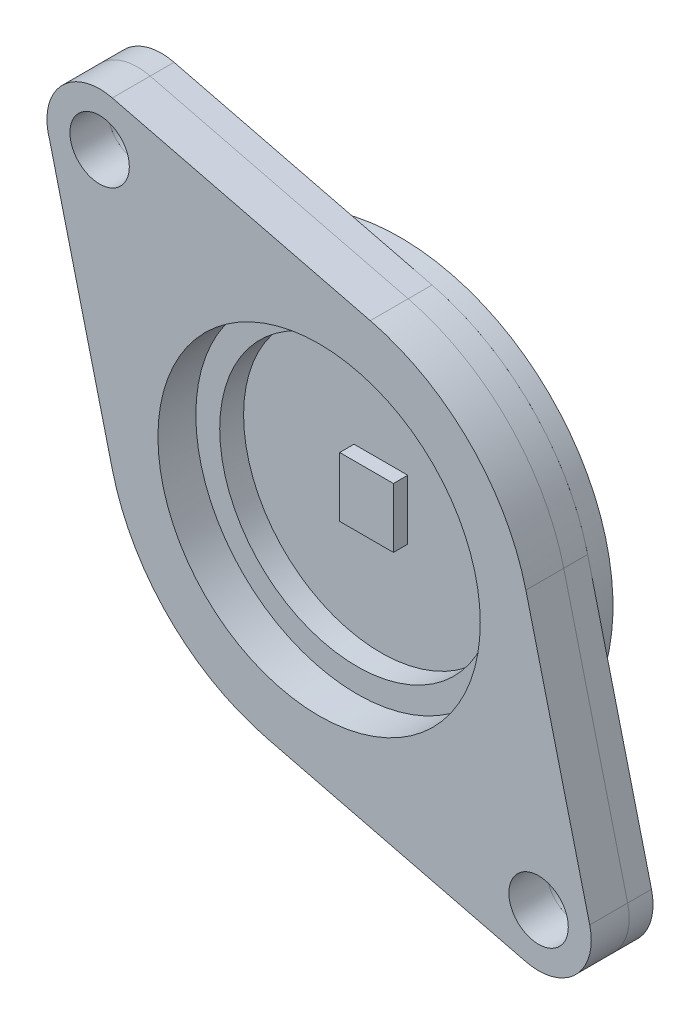
ISO-10303-21;
HEADER;
FILE_DESCRIPTION(('STEP AP214'),'2;1');
FILE_NAME('part.step','',(''),(''),'','','');
FILE_SCHEMA(('AUTOMOTIVE_DESIGN { 1 0 10303 214 1 1 1 1 }'));
ENDSEC;
DATA;
#1=APPLICATION_CONTEXT('core data for automotive mechanical design processes');
#2=APPLICATION_PROTOCOL_DEFINITION('international standard','automotive_design',2000,#1);
#3=PRODUCT_CONTEXT('',#1,'mechanical');
#4=PRODUCT('Part','Part','',(#3));
#5=PRODUCT_RELATED_PRODUCT_CATEGORY('part','',(#4));
#6=PRODUCT_DEFINITION_FORMATION('','',#4);
#7=PRODUCT_DEFINITION_CONTEXT('part definition',#1,'design');
#8=PRODUCT_DEFINITION('design','',#6,#7);
#9=PRODUCT_DEFINITION_SHAPE('','',#8);
#10=(LENGTH_UNIT() NAMED_UNIT(*) SI_UNIT(.MILLI.,.METRE.));
#11=(NAMED_UNIT(*) PLANE_ANGLE_UNIT() SI_UNIT($,.RADIAN.));
#12=(NAMED_UNIT(*) SI_UNIT($,.STERADIAN.) SOLID_ANGLE_UNIT());
#13=UNCERTAINTY_MEASURE_WITH_UNIT(LENGTH_MEASURE(1.E-05),#10,'distance_accuracy_value','');
#14=(GEOMETRIC_REPRESENTATION_CONTEXT(3) GLOBAL_UNCERTAINTY_ASSIGNED_CONTEXT((#13)) GLOBAL_UNIT_ASSIGNED_CONTEXT((#10,
#11,#12)) REPRESENTATION_CONTEXT('',''));
#15=CARTESIAN_POINT('',(0.,0.,0.));
#16=DIRECTION('',(0.,0.,1.));
#17=DIRECTION('',(1.,0.,0.));
#18=AXIS2_PLACEMENT_3D('',#15,#16,#17);
#19=CARTESIAN_POINT('',(-2.25,-2.5,-0.8));
#20=DIRECTION('',(1.,0.,0.));
#21=DIRECTION('',(0.,0.,-1.));
#22=AXIS2_PLACEMENT_3D('',#19,#20,#21);
#23=PLANE('',#22);
#24=DIRECTION('',(0.,-1.,0.));
#25=VECTOR('',#24,1.);
#26=CARTESIAN_POINT('',(-2.25,-2.5,-2.));
#27=LINE('',#26,#25);
#28=CARTESIAN_POINT('',(-2.25,2.5,-2.));
#29=VERTEX_POINT('',#28);
#30=CARTESIAN_POINT('',(-2.25,-2.5,-2.));
#31=VERTEX_POINT('',#30);
#32=EDGE_CURVE('E120',#29,#31,#27,.T.);
#33=ORIENTED_EDGE('',*,*,#32,.T.);
#34=DIRECTION('',(0.,0.,-1.));
#35=VECTOR('',#34,1.);
#36=CARTESIAN_POINT('',(-2.25,-2.5,-0.8));
#37=LINE('',#36,#35);
#38=CARTESIAN_POINT('',(-2.25,-2.5,-0.8));
#39=VERTEX_POINT('',#38);
#40=EDGE_CURVE('E12',#39,#31,#37,.T.);
#41=ORIENTED_EDGE('',*,*,#40,.F.);
#42=DIRECTION('',(0.,-1.,0.));
#43=VECTOR('',#42,1.);
#44=CARTESIAN_POINT('',(-2.25,-2.5,-0.8));
#45=LINE('',#44,#43);
#46=CARTESIAN_POINT('',(-2.25,2.5,-0.8));
#47=VERTEX_POINT('',#46);
#48=EDGE_CURVE('E104',#47,#39,#45,.T.);
#49=ORIENTED_EDGE('',*,*,#48,.F.);
#50=DIRECTION('',(0.,0.,-1.));
#51=VECTOR('',#50,1.);
#52=CARTESIAN_POINT('',(-2.25,2.5,-0.8));
#53=LINE('',#52,#51);
#54=EDGE_CURVE('E114',#47,#29,#53,.T.);
#55=ORIENTED_EDGE('',*,*,#54,.T.);
#56=EDGE_LOOP('',(#33,#41,#49,#55));
#57=FACE_BOUND('',#56,.T.);
#58=ADVANCED_FACE('F53',(#57),#23,.F.);
#59=CARTESIAN_POINT('',(2.25,-2.5,-0.8));
#60=DIRECTION('',(0.,1.,0.));
#61=DIRECTION('',(-1.,0.,0.));
#62=AXIS2_PLACEMENT_3D('',#59,#60,#61);
#63=PLANE('',#62);
#64=DIRECTION('',(1.,0.,0.));
#65=VECTOR('',#64,1.);
#66=CARTESIAN_POINT('',(2.25,-2.5,-2.));
#67=LINE('',#66,#65);
#68=CARTESIAN_POINT('',(2.25,-2.5,-2.));
#69=VERTEX_POINT('',#68);
#70=EDGE_CURVE('E108',#31,#69,#67,.T.);
#71=ORIENTED_EDGE('',*,*,#70,.T.);
#72=DIRECTION('',(0.,0.,-1.));
#73=VECTOR('',#72,1.);
#74=CARTESIAN_POINT('',(2.25,-2.5,-0.8));
#75=LINE('',#74,#73);
#76=CARTESIAN_POINT('',(2.25,-2.5,-0.8));
#77=VERTEX_POINT('',#76);
#78=EDGE_CURVE('E65',#77,#69,#75,.T.);
#79=ORIENTED_EDGE('',*,*,#78,.F.);
#80=DIRECTION('',(1.,0.,0.));
#81=VECTOR('',#80,1.);
#82=CARTESIAN_POINT('',(2.25,-2.5,-0.8));
#83=LINE('',#82,#81);
#84=EDGE_CURVE('E99',#39,#77,#83,.T.);
#85=ORIENTED_EDGE('',*,*,#84,.F.);
#86=ORIENTED_EDGE('',*,*,#40,.T.);
#87=EDGE_LOOP('',(#71,#79,#85,#86));
#88=FACE_BOUND('',#87,.T.);
#89=ADVANCED_FACE('F107',(#88),#63,.F.);
#90=CARTESIAN_POINT('',(2.25,-2.5,-0.8));
#91=DIRECTION('',(-1.,0.,0.));
#92=DIRECTION('',(0.,0.,1.));
#93=AXIS2_PLACEMENT_3D('',#90,#91,#92);
#94=PLANE('',#93);
#95=DIRECTION('',(0.,1.,0.));
#96=VECTOR('',#95,1.);
#97=CARTESIAN_POINT('',(2.25,-2.5,-2.));
#98=LINE('',#97,#96);
#99=CARTESIAN_POINT('',(2.25,2.5,-2.));
#100=VERTEX_POINT('',#99);
#101=EDGE_CURVE('E87',#69,#100,#98,.T.);
#102=ORIENTED_EDGE('',*,*,#101,.T.);
#103=DIRECTION('',(0.,0.,-1.));
#104=VECTOR('',#103,1.);
#105=CARTESIAN_POINT('',(2.25,2.5,-0.8));
#106=LINE('',#105,#104);
#107=CARTESIAN_POINT('',(2.25,2.5,-0.8));
#108=VERTEX_POINT('',#107);
#109=EDGE_CURVE('E109',#108,#100,#106,.T.);
#110=ORIENTED_EDGE('',*,*,#109,.F.);
#111=DIRECTION('',(0.,1.,0.));
#112=VECTOR('',#111,1.);
#113=CARTESIAN_POINT('',(2.25,-2.5,-0.8));
#114=LINE('',#113,#112);
#115=EDGE_CURVE('E103',#77,#108,#114,.T.);
#116=ORIENTED_EDGE('',*,*,#115,.F.);
#117=ORIENTED_EDGE('',*,*,#78,.T.);
#118=EDGE_LOOP('',(#102,#110,#116,#117));
#119=FACE_BOUND('',#118,.T.);
#120=ADVANCED_FACE('F112',(#119),#94,.F.);
#121=CARTESIAN_POINT('',(2.25,2.5,-0.8));
#122=DIRECTION('',(0.,-1.,0.));
#123=DIRECTION('',(1.,0.,0.));
#124=AXIS2_PLACEMENT_3D('',#121,#122,#123);
#125=PLANE('',#124);
#126=DIRECTION('',(-1.,0.,0.));
#127=VECTOR('',#126,1.);
#128=CARTESIAN_POINT('',(2.25,2.5,-2.));
#129=LINE('',#128,#127);
#130=EDGE_CURVE('E91',#100,#29,#129,.T.);
#131=ORIENTED_EDGE('',*,*,#130,.T.);
#132=ORIENTED_EDGE('',*,*,#54,.F.);
#133=DIRECTION('',(-1.,0.,0.));
#134=VECTOR('',#133,1.);
#135=CARTESIAN_POINT('',(2.25,2.5,-0.8));
#136=LINE('',#135,#134);
#137=EDGE_CURVE('E69',#108,#47,#136,.T.);
#138=ORIENTED_EDGE('',*,*,#137,.F.);
#139=ORIENTED_EDGE('',*,*,#109,.T.);
#140=EDGE_LOOP('',(#131,#132,#138,#139));
#141=FACE_BOUND('',#140,.T.);
#142=ADVANCED_FACE('F123',(#141),#125,.F.);
#143=CARTESIAN_POINT('',(0.,0.,-0.8));
#144=DIRECTION('',(0.,0.,1.));
#145=DIRECTION('',(1.,0.,0.));
#146=AXIS2_PLACEMENT_3D('',#143,#144,#145);
#147=PLANE('',#146);
#148=ORIENTED_EDGE('',*,*,#48,.T.);
#149=ORIENTED_EDGE('',*,*,#84,.T.);
#150=ORIENTED_EDGE('',*,*,#115,.T.);
#151=ORIENTED_EDGE('',*,*,#137,.T.);
#152=EDGE_LOOP('',(#148,#149,#150,#151));
#153=FACE_BOUND('',#152,.T.);
#154=ADVANCED_FACE('F101',(#153),#147,.T.);
#155=CARTESIAN_POINT('',(0.,0.,-2.));
#156=DIRECTION('',(0.,0.,1.));
#157=DIRECTION('',(1.,0.,0.));
#158=AXIS2_PLACEMENT_3D('',#155,#156,#157);
#159=PLANE('',#158);
#160=ORIENTED_EDGE('',*,*,#32,.F.);
#161=ORIENTED_EDGE('',*,*,#130,.F.);
#162=ORIENTED_EDGE('',*,*,#101,.F.);
#163=ORIENTED_EDGE('',*,*,#70,.F.);
#164=EDGE_LOOP('',(#160,#161,#162,#163));
#165=FACE_BOUND('',#164,.T.);
#166=ADVANCED_FACE('F130',(#165),#159,.F.);
#167=CLOSED_SHELL('',(#58,#89,#120,#142,#154,#166));
#168=MANIFOLD_SOLID_BREP('B2',#167);
#169=CARTESIAN_POINT('',(0.,0.,-3.6));
#170=DIRECTION('',(0.,0.,1.));
#171=DIRECTION('',(1.,0.,0.));
#172=AXIS2_PLACEMENT_3D('',#169,#170,#171);
#173=CYLINDRICAL_SURFACE('',#172,17.8422411287339);
#174=CARTESIAN_POINT('',(0.,0.,-2.));
#175=DIRECTION('',(0.,0.,-1.));
#176=DIRECTION('',(-1.,0.,0.));
#177=AXIS2_PLACEMENT_3D('',#174,#175,#176);
#178=CIRCLE('',#177,17.8422411287339);
#179=CARTESIAN_POINT('',(-17.8422411287339,0.,-2.));
#180=VERTEX_POINT('',#179);
#181=EDGE_CURVE('E214',#180,#180,#178,.T.);
#182=ORIENTED_EDGE('',*,*,#181,.T.);
#183=EDGE_LOOP('',(#182));
#184=FACE_BOUND('',#183,.T.);
#185=CARTESIAN_POINT('',(0.,0.,-3.6));
#186=DIRECTION('',(0.,0.,-1.));
#187=DIRECTION('',(-1.,0.,0.));
#188=AXIS2_PLACEMENT_3D('',#185,#186,#187);
#189=CIRCLE('',#188,17.8422411287339);
#190=CARTESIAN_POINT('',(-17.8422411287339,0.,-3.6));
#191=VERTEX_POINT('',#190);
#192=EDGE_CURVE('E52',#191,#191,#189,.T.);
#193=ORIENTED_EDGE('',*,*,#192,.F.);
#194=EDGE_LOOP('',(#193));
#195=FACE_BOUND('',#194,.T.);
#196=ADVANCED_FACE('F215',(#184,#195),#173,.T.);
#197=CARTESIAN_POINT('',(0.,0.,-3.6));
#198=DIRECTION('',(0.,0.,-1.));
#199=DIRECTION('',(-1.,0.,0.));
#200=AXIS2_PLACEMENT_3D('',#197,#198,#199);
#201=PLANE('',#200);
#202=ORIENTED_EDGE('',*,*,#192,.T.);
#203=EDGE_LOOP('',(#202));
#204=FACE_BOUND('',#203,.T.);
#205=ADVANCED_FACE('F229',(#204),#201,.T.);
#206=CARTESIAN_POINT('',(0.,0.,-2.));
#207=DIRECTION('',(0.,0.,-1.));
#208=DIRECTION('',(-1.,0.,0.));
#209=AXIS2_PLACEMENT_3D('',#206,#207,#208);
#210=PLANE('',#209);
#211=ORIENTED_EDGE('',*,*,#181,.F.);
#212=EDGE_LOOP('',(#211));
#213=FACE_BOUND('',#212,.T.);
#214=ADVANCED_FACE('F227',(#213),#210,.F.);
#215=CLOSED_SHELL('',(#196,#205,#214));
#216=MANIFOLD_SOLID_BREP('B6',#215);
#217=CARTESIAN_POINT('',(-18.3847763108502,18.3847763108502,-2.));
#218=DIRECTION('',(0.,0.,-1.));
#219=DIRECTION('',(-1.,0.,0.));
#220=AXIS2_PLACEMENT_3D('',#217,#218,#219);
#221=PLANE('',#220);
#222=CARTESIAN_POINT('',(18.3847763108502,-18.3847763108502,-2.));
#223=DIRECTION('',(0.,0.,-1.));
#224=DIRECTION('',(-1.,0.,0.));
#225=AXIS2_PLACEMENT_3D('',#222,#223,#224);
#226=CIRCLE('',#225,2.4892);
#227=CARTESIAN_POINT('',(15.8955763108502,-18.3847763108502,-2.));
#228=VERTEX_POINT('',#227);
#229=EDGE_CURVE('E413',#228,#228,#226,.T.);
#230=ORIENTED_EDGE('',*,*,#229,.F.);
#231=EDGE_LOOP('',(#230));
#232=FACE_BOUND('',#231,.T.);
#233=CARTESIAN_POINT('',(-18.3847763108502,18.3847763108502,-2.));
#234=DIRECTION('',(0.,0.,-1.));
#235=DIRECTION('',(-1.,0.,0.));
#236=AXIS2_PLACEMENT_3D('',#233,#234,#235);
#237=CIRCLE('',#236,4.413);
#238=CARTESIAN_POINT('',(-22.5732405003855,16.995050894453,-2.));
#239=VERTEX_POINT('',#238);
#240=CARTESIAN_POINT('',(-17.3245296189684,22.6685183610154,-2.));
#241=VERTEX_POINT('',#240);
#242=EDGE_CURVE('E380',#239,#241,#237,.T.);
#243=ORIENTED_EDGE('',*,*,#242,.T.);
#244=DIRECTION('',(0.970709732645637,-0.240255312005865,0.));
#245=VECTOR('',#244,1.);
#246=CARTESIAN_POINT('',(-17.3245296189684,22.6685183610154,-2.));
#247=LINE('',#246,#245);
#248=CARTESIAN_POINT('',(4.28669320926783,17.3196371158723,-2.));
#249=VERTEX_POINT('',#248);
#250=EDGE_CURVE('E324',#241,#249,#247,.T.);
#251=ORIENTED_EDGE('',*,*,#250,.T.);
#252=CARTESIAN_POINT('',(0.,0.,-2.));
#253=DIRECTION('',(0.,0.,-1.));
#254=DIRECTION('',(-1.,0.,0.));
#255=AXIS2_PLACEMENT_3D('',#252,#253,#254);
#256=CIRCLE('',#255,17.8422411287339);
#257=CARTESIAN_POINT('',(17.3196371158723,4.28669320926784,-2.));
#258=VERTEX_POINT('',#257);
#259=EDGE_CURVE('E395',#249,#258,#256,.T.);
#260=ORIENTED_EDGE('',*,*,#259,.T.);
#261=DIRECTION('',(0.240255312005865,-0.970709732645637,0.));
#262=VECTOR('',#261,1.);
#263=CARTESIAN_POINT('',(17.3196371158723,4.28669320926784,-2.));
#264=LINE('',#263,#262);
#265=CARTESIAN_POINT('',(22.6685183610154,-17.3245296189684,-2.));
#266=VERTEX_POINT('',#265);
#267=EDGE_CURVE('E403',#258,#266,#264,.T.);
#268=ORIENTED_EDGE('',*,*,#267,.T.);
#269=CARTESIAN_POINT('',(18.3847763108502,-18.3847763108502,-2.));
#270=DIRECTION('',(0.,0.,-1.));
#271=DIRECTION('',(-1.,0.,0.));
#272=AXIS2_PLACEMENT_3D('',#269,#270,#271);
#273=CIRCLE('',#272,4.413);
#274=CARTESIAN_POINT('',(17.3245296189684,-22.6685183610154,-2.));
#275=VERTEX_POINT('',#274);
#276=EDGE_CURVE('E343',#266,#275,#273,.T.);
#277=ORIENTED_EDGE('',*,*,#276,.T.);
#278=DIRECTION('',(-0.970709732645637,0.240255312005865,0.));
#279=VECTOR('',#278,1.);
#280=CARTESIAN_POINT('',(17.3245296189684,-22.6685183610154,-2.));
#281=LINE('',#280,#279);
#282=CARTESIAN_POINT('',(-4.28669320926784,-17.3196371158723,-2.));
#283=VERTEX_POINT('',#282);
#284=EDGE_CURVE('E339',#275,#283,#281,.T.);
#285=ORIENTED_EDGE('',*,*,#284,.T.);
#286=CARTESIAN_POINT('',(0.,0.,-2.));
#287=DIRECTION('',(0.,0.,-1.));
#288=DIRECTION('',(-1.,0.,0.));
#289=AXIS2_PLACEMENT_3D('',#286,#287,#288);
#290=CIRCLE('',#289,17.8422411287339);
#291=CARTESIAN_POINT('',(-17.3222409466544,-4.27615915067898,-2.));
#292=VERTEX_POINT('',#291);
#293=EDGE_CURVE('E345',#283,#292,#290,.T.);
#294=ORIENTED_EDGE('',*,*,#293,.T.);
#295=DIRECTION('',(-0.23966491203801,0.970855668952812,0.));
#296=VECTOR('',#295,1.);
#297=CARTESIAN_POINT('',(-17.3222409466544,-4.27615915067898,-2.));
#298=LINE('',#297,#296);
#299=EDGE_CURVE('E285',#292,#239,#298,.T.);
#300=ORIENTED_EDGE('',*,*,#299,.T.);
#301=EDGE_LOOP('',(#243,#251,#260,#268,#277,#285,#294,#300));
#302=FACE_BOUND('',#301,.T.);
#303=CARTESIAN_POINT('',(0.,0.,-2.));
#304=DIRECTION('',(0.,0.,-1.));
#305=DIRECTION('',(-1.,0.,0.));
#306=AXIS2_PLACEMENT_3D('',#303,#304,#305);
#307=CIRCLE('',#306,11.5);
#308=CARTESIAN_POINT('',(-11.5,0.,-2.));
#309=VERTEX_POINT('',#308);
#310=EDGE_CURVE('E368',#309,#309,#307,.T.);
#311=ORIENTED_EDGE('',*,*,#310,.F.);
#312=EDGE_LOOP('',(#311));
#313=FACE_BOUND('',#312,.T.);
#314=CARTESIAN_POINT('',(-18.3847763108502,18.3847763108502,-2.));
#315=DIRECTION('',(0.,0.,-1.));
#316=DIRECTION('',(-1.,0.,0.));
#317=AXIS2_PLACEMENT_3D('',#314,#315,#316);
#318=CIRCLE('',#317,2.4892);
#319=CARTESIAN_POINT('',(-20.8739763108502,18.3847763108502,-2.));
#320=VERTEX_POINT('',#319);
#321=EDGE_CURVE('E419',#320,#320,#318,.T.);
#322=ORIENTED_EDGE('',*,*,#321,.F.);
#323=EDGE_LOOP('',(#322));
#324=FACE_BOUND('',#323,.T.);
#325=ADVANCED_FACE('F264',(#232,#302,#313,#324),#221,.T.);
#326=CARTESIAN_POINT('',(-18.3847763108502,18.3847763108502,0.));
#327=DIRECTION('',(0.,0.,-1.));
#328=DIRECTION('',(-1.,0.,0.));
#329=AXIS2_PLACEMENT_3D('',#326,#327,#328);
#330=PLANE('',#329);
#331=CARTESIAN_POINT('',(-18.3847763108502,18.3847763108502,0.));
#332=DIRECTION('',(0.,0.,-1.));
#333=DIRECTION('',(-1.,0.,0.));
#334=AXIS2_PLACEMENT_3D('',#331,#332,#333);
#335=CIRCLE('',#334,4.413);
#336=CARTESIAN_POINT('',(-22.5732405003855,16.995050894453,0.));
#337=VERTEX_POINT('',#336);
#338=CARTESIAN_POINT('',(-17.3245296189684,22.6685183610154,0.));
#339=VERTEX_POINT('',#338);
#340=EDGE_CURVE('E362',#337,#339,#335,.T.);
#341=ORIENTED_EDGE('',*,*,#340,.F.);
#342=DIRECTION('',(-0.23966491203801,0.970855668952812,0.));
#343=VECTOR('',#342,1.);
#344=CARTESIAN_POINT('',(-17.3222409466544,-4.27615915067898,0.));
#345=LINE('',#344,#343);
#346=CARTESIAN_POINT('',(-17.3222409466544,-4.27615915067898,0.));
#347=VERTEX_POINT('',#346);
#348=EDGE_CURVE('E320',#347,#337,#345,.T.);
#349=ORIENTED_EDGE('',*,*,#348,.F.);
#350=CARTESIAN_POINT('',(0.,0.,0.));
#351=DIRECTION('',(0.,0.,-1.));
#352=DIRECTION('',(-1.,0.,0.));
#353=AXIS2_PLACEMENT_3D('',#350,#351,#352);
#354=CIRCLE('',#353,17.8422411287339);
#355=CARTESIAN_POINT('',(-4.28669320926784,-17.3196371158723,0.));
#356=VERTEX_POINT('',#355);
#357=EDGE_CURVE('E313',#356,#347,#354,.T.);
#358=ORIENTED_EDGE('',*,*,#357,.F.);
#359=DIRECTION('',(-0.970709732645637,0.240255312005865,0.));
#360=VECTOR('',#359,1.);
#361=CARTESIAN_POINT('',(17.3245296189684,-22.6685183610154,0.));
#362=LINE('',#361,#360);
#363=CARTESIAN_POINT('',(17.3245296189684,-22.6685183610154,0.));
#364=VERTEX_POINT('',#363);
#365=EDGE_CURVE('E355',#364,#356,#362,.T.);
#366=ORIENTED_EDGE('',*,*,#365,.F.);
#367=CARTESIAN_POINT('',(18.3847763108502,-18.3847763108502,0.));
#368=DIRECTION('',(0.,0.,-1.));
#369=DIRECTION('',(-1.,0.,0.));
#370=AXIS2_PLACEMENT_3D('',#367,#368,#369);
#371=CIRCLE('',#370,4.413);
#372=CARTESIAN_POINT('',(22.6685183610154,-17.3245296189684,0.));
#373=VERTEX_POINT('',#372);
#374=EDGE_CURVE('E375',#373,#364,#371,.T.);
#375=ORIENTED_EDGE('',*,*,#374,.F.);
#376=DIRECTION('',(0.240255312005865,-0.970709732645637,0.));
#377=VECTOR('',#376,1.);
#378=CARTESIAN_POINT('',(17.3196371158723,4.28669320926784,0.));
#379=LINE('',#378,#377);
#380=CARTESIAN_POINT('',(17.3196371158723,4.28669320926784,0.));
#381=VERTEX_POINT('',#380);
#382=EDGE_CURVE('E367',#381,#373,#379,.T.);
#383=ORIENTED_EDGE('',*,*,#382,.F.);
#384=CARTESIAN_POINT('',(0.,0.,0.));
#385=DIRECTION('',(0.,0.,-1.));
#386=DIRECTION('',(-1.,0.,0.));
#387=AXIS2_PLACEMENT_3D('',#384,#385,#386);
#388=CIRCLE('',#387,17.8422411287339);
#389=CARTESIAN_POINT('',(4.28669320926783,17.3196371158723,0.));
#390=VERTEX_POINT('',#389);
#391=EDGE_CURVE('E366',#390,#381,#388,.T.);
#392=ORIENTED_EDGE('',*,*,#391,.F.);
#393=DIRECTION('',(0.970709732645637,-0.240255312005865,0.));
#394=VECTOR('',#393,1.);
#395=CARTESIAN_POINT('',(-17.3245296189684,22.6685183610154,0.));
#396=LINE('',#395,#394);
#397=EDGE_CURVE('E364',#339,#390,#396,.T.);
#398=ORIENTED_EDGE('',*,*,#397,.F.);
#399=EDGE_LOOP('',(#341,#349,#358,#366,#375,#383,#392,#398));
#400=FACE_BOUND('',#399,.T.);
#401=CARTESIAN_POINT('',(0.,0.,0.));
#402=DIRECTION('',(0.,0.,-1.));
#403=DIRECTION('',(-1.,0.,0.));
#404=AXIS2_PLACEMENT_3D('',#401,#402,#403);
#405=CIRCLE('',#404,11.5);
#406=CARTESIAN_POINT('',(-11.5,0.,0.));
#407=VERTEX_POINT('',#406);
#408=EDGE_CURVE('E411',#407,#407,#405,.T.);
#409=ORIENTED_EDGE('',*,*,#408,.T.);
#410=EDGE_LOOP('',(#409));
#411=FACE_BOUND('',#410,.T.);
#412=CARTESIAN_POINT('',(18.3847763108502,-18.3847763108502,0.));
#413=DIRECTION('',(0.,0.,-1.));
#414=DIRECTION('',(-1.,0.,0.));
#415=AXIS2_PLACEMENT_3D('',#412,#413,#414);
#416=CIRCLE('',#415,2.4892);
#417=CARTESIAN_POINT('',(15.8955763108502,-18.3847763108502,0.));
#418=VERTEX_POINT('',#417);
#419=EDGE_CURVE('E417',#418,#418,#416,.T.);
#420=ORIENTED_EDGE('',*,*,#419,.T.);
#421=EDGE_LOOP('',(#420));
#422=FACE_BOUND('',#421,.T.);
#423=CARTESIAN_POINT('',(-18.3847763108502,18.3847763108502,0.));
#424=DIRECTION('',(0.,0.,-1.));
#425=DIRECTION('',(-1.,0.,0.));
#426=AXIS2_PLACEMENT_3D('',#423,#424,#425);
#427=CIRCLE('',#426,2.4892);
#428=CARTESIAN_POINT('',(-20.8739763108502,18.3847763108502,0.));
#429=VERTEX_POINT('',#428);
#430=EDGE_CURVE('E421',#429,#429,#427,.T.);
#431=ORIENTED_EDGE('',*,*,#430,.T.);
#432=EDGE_LOOP('',(#431));
#433=FACE_BOUND('',#432,.T.);
#434=ADVANCED_FACE('F396',(#400,#411,#422,#433),#330,.F.);
#435=CARTESIAN_POINT('',(-18.3847763108502,18.3847763108502,-2.));
#436=DIRECTION('',(0.,0.,1.));
#437=DIRECTION('',(1.,0.,0.));
#438=AXIS2_PLACEMENT_3D('',#435,#436,#437);
#439=CYLINDRICAL_SURFACE('',#438,4.413);
#440=ORIENTED_EDGE('',*,*,#340,.T.);
#441=DIRECTION('',(0.,0.,1.));
#442=VECTOR('',#441,1.);
#443=CARTESIAN_POINT('',(-17.3245296189684,22.6685183610154,-2.));
#444=LINE('',#443,#442);
#445=EDGE_CURVE('E209',#241,#339,#444,.T.);
#446=ORIENTED_EDGE('',*,*,#445,.F.);
#447=ORIENTED_EDGE('',*,*,#242,.F.);
#448=DIRECTION('',(0.,0.,1.));
#449=VECTOR('',#448,1.);
#450=CARTESIAN_POINT('',(-22.5732405003855,16.995050894453,-2.));
#451=LINE('',#450,#449);
#452=EDGE_CURVE('E357',#239,#337,#451,.T.);
#453=ORIENTED_EDGE('',*,*,#452,.T.);
#454=EDGE_LOOP('',(#440,#446,#447,#453));
#455=FACE_BOUND('',#454,.T.);
#456=ADVANCED_FACE('F270',(#455),#439,.T.);
#457=CARTESIAN_POINT('',(-17.3245296189684,22.6685183610154,-2.));
#458=DIRECTION('',(-0.240255312005865,-0.970709732645637,0.));
#459=DIRECTION('',(0.970709732645637,-0.240255312005865,0.));
#460=AXIS2_PLACEMENT_3D('',#457,#458,#459);
#461=PLANE('',#460);
#462=ORIENTED_EDGE('',*,*,#397,.T.);
#463=DIRECTION('',(0.,0.,1.));
#464=VECTOR('',#463,1.);
#465=CARTESIAN_POINT('',(4.28669320926783,17.3196371158723,-2.));
#466=LINE('',#465,#464);
#467=EDGE_CURVE('E273',#249,#390,#466,.T.);
#468=ORIENTED_EDGE('',*,*,#467,.F.);
#469=ORIENTED_EDGE('',*,*,#250,.F.);
#470=ORIENTED_EDGE('',*,*,#445,.T.);
#471=EDGE_LOOP('',(#462,#468,#469,#470));
#472=FACE_BOUND('',#471,.T.);
#473=ADVANCED_FACE('F457',(#472),#461,.F.);
#474=CARTESIAN_POINT('',(0.,0.,-2.));
#475=DIRECTION('',(0.,0.,1.));
#476=DIRECTION('',(1.,0.,0.));
#477=AXIS2_PLACEMENT_3D('',#474,#475,#476);
#478=CYLINDRICAL_SURFACE('',#477,17.8422411287339);
#479=ORIENTED_EDGE('',*,*,#391,.T.);
#480=DIRECTION('',(0.,0.,1.));
#481=VECTOR('',#480,1.);
#482=CARTESIAN_POINT('',(17.3196371158723,4.28669320926784,-2.));
#483=LINE('',#482,#481);
#484=EDGE_CURVE('E383',#258,#381,#483,.T.);
#485=ORIENTED_EDGE('',*,*,#484,.F.);
#486=ORIENTED_EDGE('',*,*,#259,.F.);
#487=ORIENTED_EDGE('',*,*,#467,.T.);
#488=EDGE_LOOP('',(#479,#485,#486,#487));
#489=FACE_BOUND('',#488,.T.);
#490=ADVANCED_FACE('F388',(#489),#478,.T.);
#491=CARTESIAN_POINT('',(17.3196371158723,4.28669320926784,-2.));
#492=DIRECTION('',(-0.970709732645637,-0.240255312005865,0.));
#493=DIRECTION('',(0.240255312005865,-0.970709732645637,0.));
#494=AXIS2_PLACEMENT_3D('',#491,#492,#493);
#495=PLANE('',#494);
#496=ORIENTED_EDGE('',*,*,#382,.T.);
#497=DIRECTION('',(0.,0.,1.));
#498=VECTOR('',#497,1.);
#499=CARTESIAN_POINT('',(22.6685183610154,-17.3245296189684,-2.));
#500=LINE('',#499,#498);
#501=EDGE_CURVE('E381',#266,#373,#500,.T.);
#502=ORIENTED_EDGE('',*,*,#501,.F.);
#503=ORIENTED_EDGE('',*,*,#267,.F.);
#504=ORIENTED_EDGE('',*,*,#484,.T.);
#505=EDGE_LOOP('',(#496,#502,#503,#504));
#506=FACE_BOUND('',#505,.T.);
#507=ADVANCED_FACE('F402',(#506),#495,.F.);
#508=CARTESIAN_POINT('',(18.3847763108502,-18.3847763108502,-2.));
#509=DIRECTION('',(0.,0.,1.));
#510=DIRECTION('',(1.,0.,0.));
#511=AXIS2_PLACEMENT_3D('',#508,#509,#510);
#512=CYLINDRICAL_SURFACE('',#511,4.413);
#513=ORIENTED_EDGE('',*,*,#374,.T.);
#514=DIRECTION('',(0.,0.,1.));
#515=VECTOR('',#514,1.);
#516=CARTESIAN_POINT('',(17.3245296189684,-22.6685183610154,-2.));
#517=LINE('',#516,#515);
#518=EDGE_CURVE('E354',#275,#364,#517,.T.);
#519=ORIENTED_EDGE('',*,*,#518,.F.);
#520=ORIENTED_EDGE('',*,*,#276,.F.);
#521=ORIENTED_EDGE('',*,*,#501,.T.);
#522=EDGE_LOOP('',(#513,#519,#520,#521));
#523=FACE_BOUND('',#522,.T.);
#524=ADVANCED_FACE('F404',(#523),#512,.T.);
#525=CARTESIAN_POINT('',(17.3245296189684,-22.6685183610154,-2.));
#526=DIRECTION('',(0.240255312005865,0.970709732645637,0.));
#527=DIRECTION('',(-0.970709732645637,0.240255312005865,0.));
#528=AXIS2_PLACEMENT_3D('',#525,#526,#527);
#529=PLANE('',#528);
#530=ORIENTED_EDGE('',*,*,#365,.T.);
#531=DIRECTION('',(0.,0.,1.));
#532=VECTOR('',#531,1.);
#533=CARTESIAN_POINT('',(-4.28669320926784,-17.3196371158723,-2.));
#534=LINE('',#533,#532);
#535=EDGE_CURVE('E349',#283,#356,#534,.T.);
#536=ORIENTED_EDGE('',*,*,#535,.F.);
#537=ORIENTED_EDGE('',*,*,#284,.F.);
#538=ORIENTED_EDGE('',*,*,#518,.T.);
#539=EDGE_LOOP('',(#530,#536,#537,#538));
#540=FACE_BOUND('',#539,.T.);
#541=ADVANCED_FACE('F348',(#540),#529,.F.);
#542=CARTESIAN_POINT('',(0.,0.,-2.));
#543=DIRECTION('',(0.,0.,1.));
#544=DIRECTION('',(1.,0.,0.));
#545=AXIS2_PLACEMENT_3D('',#542,#543,#544);
#546=CYLINDRICAL_SURFACE('',#545,17.8422411287339);
#547=ORIENTED_EDGE('',*,*,#357,.T.);
#548=DIRECTION('',(0.,0.,1.));
#549=VECTOR('',#548,1.);
#550=CARTESIAN_POINT('',(-17.3222409466544,-4.27615915067898,-2.));
#551=LINE('',#550,#549);
#552=EDGE_CURVE('E351',#292,#347,#551,.T.);
#553=ORIENTED_EDGE('',*,*,#552,.F.);
#554=ORIENTED_EDGE('',*,*,#293,.F.);
#555=ORIENTED_EDGE('',*,*,#535,.T.);
#556=EDGE_LOOP('',(#547,#553,#554,#555));
#557=FACE_BOUND('',#556,.T.);
#558=ADVANCED_FACE('F356',(#557),#546,.T.);
#559=CARTESIAN_POINT('',(-17.3222409466544,-4.27615915067898,-2.));
#560=DIRECTION('',(0.970855668952812,0.23966491203801,0.));
#561=DIRECTION('',(-0.23966491203801,0.970855668952812,0.));
#562=AXIS2_PLACEMENT_3D('',#559,#560,#561);
#563=PLANE('',#562);
#564=ORIENTED_EDGE('',*,*,#348,.T.);
#565=ORIENTED_EDGE('',*,*,#452,.F.);
#566=ORIENTED_EDGE('',*,*,#299,.F.);
#567=ORIENTED_EDGE('',*,*,#552,.T.);
#568=EDGE_LOOP('',(#564,#565,#566,#567));
#569=FACE_BOUND('',#568,.T.);
#570=ADVANCED_FACE('F441',(#569),#563,.F.);
#571=CARTESIAN_POINT('',(0.,0.,-2.));
#572=DIRECTION('',(0.,0.,1.));
#573=DIRECTION('',(1.,0.,0.));
#574=AXIS2_PLACEMENT_3D('',#571,#572,#573);
#575=CYLINDRICAL_SURFACE('',#574,11.5);
#576=ORIENTED_EDGE('',*,*,#310,.T.);
#577=EDGE_LOOP('',(#576));
#578=FACE_BOUND('',#577,.T.);
#579=ORIENTED_EDGE('',*,*,#408,.F.);
#580=EDGE_LOOP('',(#579));
#581=FACE_BOUND('',#580,.T.);
#582=ADVANCED_FACE('F442',(#578,#581),#575,.F.);
#583=CARTESIAN_POINT('',(18.3847763108502,-18.3847763108502,-2.));
#584=DIRECTION('',(0.,0.,1.));
#585=DIRECTION('',(1.,0.,0.));
#586=AXIS2_PLACEMENT_3D('',#583,#584,#585);
#587=CYLINDRICAL_SURFACE('',#586,2.4892);
#588=ORIENTED_EDGE('',*,*,#229,.T.);
#589=EDGE_LOOP('',(#588));
#590=FACE_BOUND('',#589,.T.);
#591=ORIENTED_EDGE('',*,*,#419,.F.);
#592=EDGE_LOOP('',(#591));
#593=FACE_BOUND('',#592,.T.);
#594=ADVANCED_FACE('F516',(#590,#593),#587,.F.);
#595=CARTESIAN_POINT('',(-18.3847763108502,18.3847763108502,-2.));
#596=DIRECTION('',(0.,0.,1.));
#597=DIRECTION('',(1.,0.,0.));
#598=AXIS2_PLACEMENT_3D('',#595,#596,#597);
#599=CYLINDRICAL_SURFACE('',#598,2.4892);
#600=ORIENTED_EDGE('',*,*,#321,.T.);
#601=EDGE_LOOP('',(#600));
#602=FACE_BOUND('',#601,.T.);
#603=ORIENTED_EDGE('',*,*,#430,.F.);
#604=EDGE_LOOP('',(#603));
#605=FACE_BOUND('',#604,.T.);
#606=ADVANCED_FACE('F427',(#602,#605),#599,.F.);
#607=CLOSED_SHELL('',(#325,#434,#456,#473,#490,#507,#524,#541,#558,#570,#582,#594,#606));
#608=MANIFOLD_SOLID_BREP('B48',#607);
#609=CARTESIAN_POINT('',(-18.3847763108502,18.3847763108502,3.175));
#610=DIRECTION('',(0.,0.,1.));
#611=DIRECTION('',(1.,0.,0.));
#612=AXIS2_PLACEMENT_3D('',#609,#610,#611);
#613=PLANE('',#612);
#614=CARTESIAN_POINT('',(-18.3847763108502,18.3847763108502,3.175));
#615=DIRECTION('',(0.,0.,1.));
#616=DIRECTION('',(1.,0.,0.));
#617=AXIS2_PLACEMENT_3D('',#614,#615,#616);
#618=CIRCLE('',#617,2.4892);
#619=CARTESIAN_POINT('',(-15.8955763108502,18.3847763108502,3.175));
#620=VERTEX_POINT('',#619);
#621=EDGE_CURVE('E717',#620,#620,#618,.T.);
#622=ORIENTED_EDGE('',*,*,#621,.F.);
#623=EDGE_LOOP('',(#622));
#624=FACE_BOUND('',#623,.T.);
#625=CARTESIAN_POINT('',(18.3847763108502,-18.3847763108502,3.175));
#626=DIRECTION('',(0.,0.,1.));
#627=DIRECTION('',(1.,0.,0.));
#628=AXIS2_PLACEMENT_3D('',#625,#626,#627);
#629=CIRCLE('',#628,2.4892);
#630=CARTESIAN_POINT('',(20.8739763108502,-18.3847763108502,3.175));
#631=VERTEX_POINT('',#630);
#632=EDGE_CURVE('E709',#631,#631,#629,.T.);
#633=ORIENTED_EDGE('',*,*,#632,.F.);
#634=EDGE_LOOP('',(#633));
#635=FACE_BOUND('',#634,.T.);
#636=CARTESIAN_POINT('',(-18.3847763108502,18.3847763108502,3.175));
#637=DIRECTION('',(0.,0.,1.));
#638=DIRECTION('',(1.,0.,0.));
#639=AXIS2_PLACEMENT_3D('',#636,#637,#638);
#640=CIRCLE('',#639,4.413);
#641=CARTESIAN_POINT('',(-17.3245296189684,22.6685183610154,3.175));
#642=VERTEX_POINT('',#641);
#643=CARTESIAN_POINT('',(-22.5732405003855,16.995050894453,3.175));
#644=VERTEX_POINT('',#643);
#645=EDGE_CURVE('E669',#642,#644,#640,.T.);
#646=ORIENTED_EDGE('',*,*,#645,.T.);
#647=DIRECTION('',(0.23966491203801,-0.970855668952812,0.));
#648=VECTOR('',#647,1.);
#649=CARTESIAN_POINT('',(-22.5732405003855,16.995050894453,3.175));
#650=LINE('',#649,#648);
#651=CARTESIAN_POINT('',(-17.3222409466544,-4.27615915067898,3.175));
#652=VERTEX_POINT('',#651);
#653=EDGE_CURVE('E616',#644,#652,#650,.T.);
#654=ORIENTED_EDGE('',*,*,#653,.T.);
#655=CARTESIAN_POINT('',(0.,0.,3.175));
#656=DIRECTION('',(0.,0.,1.));
#657=DIRECTION('',(1.,0.,0.));
#658=AXIS2_PLACEMENT_3D('',#655,#656,#657);
#659=CIRCLE('',#658,17.8422411287339);
#660=CARTESIAN_POINT('',(-4.28669320926785,-17.3196371158723,3.175));
#661=VERTEX_POINT('',#660);
#662=EDGE_CURVE('E684',#652,#661,#659,.T.);
#663=ORIENTED_EDGE('',*,*,#662,.T.);
#664=DIRECTION('',(0.970709732645637,-0.240255312005865,0.));
#665=VECTOR('',#664,1.);
#666=CARTESIAN_POINT('',(-4.28669320926784,-17.3196371158723,3.175));
#667=LINE('',#666,#665);
#668=CARTESIAN_POINT('',(17.3245296189684,-22.6685183610154,3.175));
#669=VERTEX_POINT('',#668);
#670=EDGE_CURVE('E698',#661,#669,#667,.T.);
#671=ORIENTED_EDGE('',*,*,#670,.T.);
#672=CARTESIAN_POINT('',(18.3847763108502,-18.3847763108502,3.175));
#673=DIRECTION('',(0.,0.,1.));
#674=DIRECTION('',(1.,0.,0.));
#675=AXIS2_PLACEMENT_3D('',#672,#673,#674);
#676=CIRCLE('',#675,4.413);
#677=CARTESIAN_POINT('',(22.6685183610154,-17.3245296189684,3.175));
#678=VERTEX_POINT('',#677);
#679=EDGE_CURVE('E634',#669,#678,#676,.T.);
#680=ORIENTED_EDGE('',*,*,#679,.T.);
#681=DIRECTION('',(-0.240255312005865,0.970709732645637,0.));
#682=VECTOR('',#681,1.);
#683=CARTESIAN_POINT('',(17.3196371158723,4.28669320926784,3.175));
#684=LINE('',#683,#682);
#685=CARTESIAN_POINT('',(17.3196371158723,4.28669320926784,3.175));
#686=VERTEX_POINT('',#685);
#687=EDGE_CURVE('E626',#678,#686,#684,.T.);
#688=ORIENTED_EDGE('',*,*,#687,.T.);
#689=CARTESIAN_POINT('',(0.,0.,3.175));
#690=DIRECTION('',(0.,0.,1.));
#691=DIRECTION('',(1.,0.,0.));
#692=AXIS2_PLACEMENT_3D('',#689,#690,#691);
#693=CIRCLE('',#692,17.8422411287339);
#694=CARTESIAN_POINT('',(4.28669320926784,17.3196371158723,3.175));
#695=VERTEX_POINT('',#694);
#696=EDGE_CURVE('E632',#686,#695,#693,.T.);
#697=ORIENTED_EDGE('',*,*,#696,.T.);
#698=DIRECTION('',(-0.970709732645637,0.240255312005865,0.));
#699=VECTOR('',#698,1.);
#700=CARTESIAN_POINT('',(-17.3245296189684,22.6685183610154,3.175));
#701=LINE('',#700,#699);
#702=EDGE_CURVE('E574',#695,#642,#701,.T.);
#703=ORIENTED_EDGE('',*,*,#702,.T.);
#704=EDGE_LOOP('',(#646,#654,#663,#671,#680,#688,#697,#703));
#705=FACE_BOUND('',#704,.T.);
#706=CARTESIAN_POINT('',(0.,0.,3.175));
#707=DIRECTION('',(0.,0.,1.));
#708=DIRECTION('',(1.,0.,0.));
#709=AXIS2_PLACEMENT_3D('',#706,#707,#708);
#710=CIRCLE('',#709,13.5);
#711=CARTESIAN_POINT('',(13.5,0.,3.175));
#712=VERTEX_POINT('',#711);
#713=EDGE_CURVE('E660',#712,#712,#710,.T.);
#714=ORIENTED_EDGE('',*,*,#713,.F.);
#715=EDGE_LOOP('',(#714));
#716=FACE_BOUND('',#715,.T.);
#717=ADVANCED_FACE('F557',(#624,#635,#705,#716),#613,.T.);
#718=CARTESIAN_POINT('',(-18.3847763108502,18.3847763108502,0.));
#719=DIRECTION('',(0.,0.,1.));
#720=DIRECTION('',(1.,0.,0.));
#721=AXIS2_PLACEMENT_3D('',#718,#719,#720);
#722=PLANE('',#721);
#723=CARTESIAN_POINT('',(-18.3847763108502,18.3847763108502,0.));
#724=DIRECTION('',(0.,0.,1.));
#725=DIRECTION('',(1.,0.,0.));
#726=AXIS2_PLACEMENT_3D('',#723,#724,#725);
#727=CIRCLE('',#726,2.4892);
#728=CARTESIAN_POINT('',(-15.8955763108502,18.3847763108502,0.));
#729=VERTEX_POINT('',#728);
#730=EDGE_CURVE('E712',#729,#729,#727,.T.);
#731=ORIENTED_EDGE('',*,*,#730,.T.);
#732=EDGE_LOOP('',(#731));
#733=FACE_BOUND('',#732,.T.);
#734=CARTESIAN_POINT('',(18.3847763108502,-18.3847763108502,0.));
#735=DIRECTION('',(0.,0.,1.));
#736=DIRECTION('',(1.,0.,0.));
#737=AXIS2_PLACEMENT_3D('',#734,#735,#736);
#738=CIRCLE('',#737,2.4892);
#739=CARTESIAN_POINT('',(20.8739763108502,-18.3847763108502,0.));
#740=VERTEX_POINT('',#739);
#741=EDGE_CURVE('E704',#740,#740,#738,.T.);
#742=ORIENTED_EDGE('',*,*,#741,.T.);
#743=EDGE_LOOP('',(#742));
#744=FACE_BOUND('',#743,.T.);
#745=CARTESIAN_POINT('',(-18.3847763108502,18.3847763108502,0.));
#746=DIRECTION('',(0.,0.,1.));
#747=DIRECTION('',(1.,0.,0.));
#748=AXIS2_PLACEMENT_3D('',#745,#746,#747);
#749=CIRCLE('',#748,4.413);
#750=CARTESIAN_POINT('',(-17.3245296189684,22.6685183610154,0.));
#751=VERTEX_POINT('',#750);
#752=CARTESIAN_POINT('',(-22.5732405003855,16.995050894453,0.));
#753=VERTEX_POINT('',#752);
#754=EDGE_CURVE('E653',#751,#753,#749,.T.);
#755=ORIENTED_EDGE('',*,*,#754,.F.);
#756=DIRECTION('',(-0.970709732645637,0.240255312005865,0.));
#757=VECTOR('',#756,1.);
#758=CARTESIAN_POINT('',(-17.3245296189684,22.6685183610154,0.));
#759=LINE('',#758,#757);
#760=CARTESIAN_POINT('',(4.28669320926784,17.3196371158723,0.));
#761=VERTEX_POINT('',#760);
#762=EDGE_CURVE('E609',#761,#751,#759,.T.);
#763=ORIENTED_EDGE('',*,*,#762,.F.);
#764=CARTESIAN_POINT('',(0.,0.,0.));
#765=DIRECTION('',(0.,0.,1.));
#766=DIRECTION('',(1.,0.,0.));
#767=AXIS2_PLACEMENT_3D('',#764,#765,#766);
#768=CIRCLE('',#767,17.8422411287339);
#769=CARTESIAN_POINT('',(17.3196371158723,4.28669320926784,0.));
#770=VERTEX_POINT('',#769);
#771=EDGE_CURVE('E605',#770,#761,#768,.T.);
#772=ORIENTED_EDGE('',*,*,#771,.F.);
#773=DIRECTION('',(-0.240255312005865,0.970709732645637,0.));
#774=VECTOR('',#773,1.);
#775=CARTESIAN_POINT('',(17.3196371158723,4.28669320926784,0.));
#776=LINE('',#775,#774);
#777=CARTESIAN_POINT('',(22.6685183610154,-17.3245296189684,0.));
#778=VERTEX_POINT('',#777);
#779=EDGE_CURVE('E641',#778,#770,#776,.T.);
#780=ORIENTED_EDGE('',*,*,#779,.F.);
#781=CARTESIAN_POINT('',(18.3847763108502,-18.3847763108502,0.));
#782=DIRECTION('',(0.,0.,1.));
#783=DIRECTION('',(1.,0.,0.));
#784=AXIS2_PLACEMENT_3D('',#781,#782,#783);
#785=CIRCLE('',#784,4.413);
#786=CARTESIAN_POINT('',(17.3245296189684,-22.6685183610154,0.));
#787=VERTEX_POINT('',#786);
#788=EDGE_CURVE('E664',#787,#778,#785,.T.);
#789=ORIENTED_EDGE('',*,*,#788,.F.);
#790=DIRECTION('',(0.970709732645637,-0.240255312005865,0.));
#791=VECTOR('',#790,1.);
#792=CARTESIAN_POINT('',(-4.28669320926784,-17.3196371158723,0.));
#793=LINE('',#792,#791);
#794=CARTESIAN_POINT('',(-4.28669320926785,-17.3196371158723,0.));
#795=VERTEX_POINT('',#794);
#796=EDGE_CURVE('E662',#795,#787,#793,.T.);
#797=ORIENTED_EDGE('',*,*,#796,.F.);
#798=CARTESIAN_POINT('',(0.,0.,0.));
#799=DIRECTION('',(0.,0.,1.));
#800=DIRECTION('',(1.,0.,0.));
#801=AXIS2_PLACEMENT_3D('',#798,#799,#800);
#802=CIRCLE('',#801,17.8422411287339);
#803=CARTESIAN_POINT('',(-17.3222409466544,-4.27615915067898,0.));
#804=VERTEX_POINT('',#803);
#805=EDGE_CURVE('E658',#804,#795,#802,.T.);
#806=ORIENTED_EDGE('',*,*,#805,.F.);
#807=DIRECTION('',(0.23966491203801,-0.970855668952812,0.));
#808=VECTOR('',#807,1.);
#809=CARTESIAN_POINT('',(-22.5732405003855,16.995050894453,0.));
#810=LINE('',#809,#808);
#811=EDGE_CURVE('E656',#753,#804,#810,.T.);
#812=ORIENTED_EDGE('',*,*,#811,.F.);
#813=EDGE_LOOP('',(#755,#763,#772,#780,#789,#797,#806,#812));
#814=FACE_BOUND('',#813,.T.);
#815=CARTESIAN_POINT('',(0.,0.,0.));
#816=DIRECTION('',(0.,0.,1.));
#817=DIRECTION('',(1.,0.,0.));
#818=AXIS2_PLACEMENT_3D('',#815,#816,#817);
#819=CIRCLE('',#818,13.5);
#820=CARTESIAN_POINT('',(13.5,0.,0.));
#821=VERTEX_POINT('',#820);
#822=EDGE_CURVE('E705',#821,#821,#819,.T.);
#823=ORIENTED_EDGE('',*,*,#822,.T.);
#824=EDGE_LOOP('',(#823));
#825=FACE_BOUND('',#824,.T.);
#826=ADVANCED_FACE('F690',(#733,#744,#814,#825),#722,.F.);
#827=CARTESIAN_POINT('',(-18.3847763108502,18.3847763108502,3.175));
#828=DIRECTION('',(0.,0.,-1.));
#829=DIRECTION('',(-1.,0.,0.));
#830=AXIS2_PLACEMENT_3D('',#827,#828,#829);
#831=CYLINDRICAL_SURFACE('',#830,4.413);
#832=ORIENTED_EDGE('',*,*,#754,.T.);
#833=DIRECTION('',(0.,0.,-1.));
#834=VECTOR('',#833,1.);
#835=CARTESIAN_POINT('',(-22.5732405003855,16.995050894453,3.175));
#836=LINE('',#835,#834);
#837=EDGE_CURVE('E263',#644,#753,#836,.T.);
#838=ORIENTED_EDGE('',*,*,#837,.F.);
#839=ORIENTED_EDGE('',*,*,#645,.F.);
#840=DIRECTION('',(0.,0.,-1.));
#841=VECTOR('',#840,1.);
#842=CARTESIAN_POINT('',(-17.3245296189684,22.6685183610154,3.175));
#843=LINE('',#842,#841);
#844=EDGE_CURVE('E647',#642,#751,#843,.T.);
#845=ORIENTED_EDGE('',*,*,#844,.T.);
#846=EDGE_LOOP('',(#832,#838,#839,#845));
#847=FACE_BOUND('',#846,.T.);
#848=ADVANCED_FACE('F559',(#847),#831,.T.);
#849=CARTESIAN_POINT('',(-22.5732405003855,16.995050894453,3.175));
#850=DIRECTION('',(0.970855668952812,0.23966491203801,0.));
#851=DIRECTION('',(-0.23966491203801,0.970855668952813,0.));
#852=AXIS2_PLACEMENT_3D('',#849,#850,#851);
#853=PLANE('',#852);
#854=ORIENTED_EDGE('',*,*,#811,.T.);
#855=DIRECTION('',(0.,0.,-1.));
#856=VECTOR('',#855,1.);
#857=CARTESIAN_POINT('',(-17.3222409466544,-4.27615915067898,3.175));
#858=LINE('',#857,#856);
#859=EDGE_CURVE('E564',#652,#804,#858,.T.);
#860=ORIENTED_EDGE('',*,*,#859,.F.);
#861=ORIENTED_EDGE('',*,*,#653,.F.);
#862=ORIENTED_EDGE('',*,*,#837,.T.);
#863=EDGE_LOOP('',(#854,#860,#861,#862));
#864=FACE_BOUND('',#863,.T.);
#865=ADVANCED_FACE('F760',(#864),#853,.F.);
#866=CARTESIAN_POINT('',(0.,0.,3.175));
#867=DIRECTION('',(0.,0.,-1.));
#868=DIRECTION('',(-1.,0.,0.));
#869=AXIS2_PLACEMENT_3D('',#866,#867,#868);
#870=CYLINDRICAL_SURFACE('',#869,17.8422411287339);
#871=ORIENTED_EDGE('',*,*,#805,.T.);
#872=DIRECTION('',(0.,0.,-1.));
#873=VECTOR('',#872,1.);
#874=CARTESIAN_POINT('',(-4.28669320926785,-17.3196371158723,3.175));
#875=LINE('',#874,#873);
#876=EDGE_CURVE('E674',#661,#795,#875,.T.);
#877=ORIENTED_EDGE('',*,*,#876,.F.);
#878=ORIENTED_EDGE('',*,*,#662,.F.);
#879=ORIENTED_EDGE('',*,*,#859,.T.);
#880=EDGE_LOOP('',(#871,#877,#878,#879));
#881=FACE_BOUND('',#880,.T.);
#882=ADVANCED_FACE('F682',(#881),#870,.T.);
#883=CARTESIAN_POINT('',(-4.28669320926784,-17.3196371158723,3.175));
#884=DIRECTION('',(0.240255312005865,0.970709732645637,0.));
#885=DIRECTION('',(-0.970709732645637,0.240255312005865,0.));
#886=AXIS2_PLACEMENT_3D('',#883,#884,#885);
#887=PLANE('',#886);
#888=ORIENTED_EDGE('',*,*,#796,.T.);
#889=DIRECTION('',(0.,0.,-1.));
#890=VECTOR('',#889,1.);
#891=CARTESIAN_POINT('',(17.3245296189684,-22.6685183610154,3.175));
#892=LINE('',#891,#890);
#893=EDGE_CURVE('E675',#669,#787,#892,.T.);
#894=ORIENTED_EDGE('',*,*,#893,.F.);
#895=ORIENTED_EDGE('',*,*,#670,.F.);
#896=ORIENTED_EDGE('',*,*,#876,.T.);
#897=EDGE_LOOP('',(#888,#894,#895,#896));
#898=FACE_BOUND('',#897,.T.);
#899=ADVANCED_FACE('F692',(#898),#887,.F.);
#900=CARTESIAN_POINT('',(18.3847763108502,-18.3847763108502,3.175));
#901=DIRECTION('',(0.,0.,-1.));
#902=DIRECTION('',(-1.,0.,0.));
#903=AXIS2_PLACEMENT_3D('',#900,#901,#902);
#904=CYLINDRICAL_SURFACE('',#903,4.413);
#905=ORIENTED_EDGE('',*,*,#788,.T.);
#906=DIRECTION('',(0.,0.,-1.));
#907=VECTOR('',#906,1.);
#908=CARTESIAN_POINT('',(22.6685183610154,-17.3245296189684,3.175));
#909=LINE('',#908,#907);
#910=EDGE_CURVE('E644',#678,#778,#909,.T.);
#911=ORIENTED_EDGE('',*,*,#910,.F.);
#912=ORIENTED_EDGE('',*,*,#679,.F.);
#913=ORIENTED_EDGE('',*,*,#893,.T.);
#914=EDGE_LOOP('',(#905,#911,#912,#913));
#915=FACE_BOUND('',#914,.T.);
#916=ADVANCED_FACE('F694',(#915),#904,.T.);
#917=CARTESIAN_POINT('',(17.3196371158723,4.28669320926784,3.175));
#918=DIRECTION('',(-0.970709732645637,-0.240255312005865,0.));
#919=DIRECTION('',(0.240255312005865,-0.970709732645637,0.));
#920=AXIS2_PLACEMENT_3D('',#917,#918,#919);
#921=PLANE('',#920);
#922=ORIENTED_EDGE('',*,*,#779,.T.);
#923=DIRECTION('',(0.,0.,-1.));
#924=VECTOR('',#923,1.);
#925=CARTESIAN_POINT('',(17.3196371158723,4.28669320926784,3.175));
#926=LINE('',#925,#924);
#927=EDGE_CURVE('E639',#686,#770,#926,.T.);
#928=ORIENTED_EDGE('',*,*,#927,.F.);
#929=ORIENTED_EDGE('',*,*,#687,.F.);
#930=ORIENTED_EDGE('',*,*,#910,.T.);
#931=EDGE_LOOP('',(#922,#928,#929,#930));
#932=FACE_BOUND('',#931,.T.);
#933=ADVANCED_FACE('F643',(#932),#921,.F.);
#934=CARTESIAN_POINT('',(0.,0.,3.175));
#935=DIRECTION('',(0.,0.,-1.));
#936=DIRECTION('',(-1.,0.,0.));
#937=AXIS2_PLACEMENT_3D('',#934,#935,#936);
#938=CYLINDRICAL_SURFACE('',#937,17.8422411287339);
#939=ORIENTED_EDGE('',*,*,#771,.T.);
#940=DIRECTION('',(0.,0.,-1.));
#941=VECTOR('',#940,1.);
#942=CARTESIAN_POINT('',(4.28669320926784,17.3196371158723,3.175));
#943=LINE('',#942,#941);
#944=EDGE_CURVE('E642',#695,#761,#943,.T.);
#945=ORIENTED_EDGE('',*,*,#944,.F.);
#946=ORIENTED_EDGE('',*,*,#696,.F.);
#947=ORIENTED_EDGE('',*,*,#927,.T.);
#948=EDGE_LOOP('',(#939,#945,#946,#947));
#949=FACE_BOUND('',#948,.T.);
#950=ADVANCED_FACE('F650',(#949),#938,.T.);
#951=CARTESIAN_POINT('',(-17.3245296189684,22.6685183610154,3.175));
#952=DIRECTION('',(-0.240255312005865,-0.970709732645637,0.));
#953=DIRECTION('',(0.970709732645637,-0.240255312005865,0.));
#954=AXIS2_PLACEMENT_3D('',#951,#952,#953);
#955=PLANE('',#954);
#956=ORIENTED_EDGE('',*,*,#762,.T.);
#957=ORIENTED_EDGE('',*,*,#844,.F.);
#958=ORIENTED_EDGE('',*,*,#702,.F.);
#959=ORIENTED_EDGE('',*,*,#944,.T.);
#960=EDGE_LOOP('',(#956,#957,#958,#959));
#961=FACE_BOUND('',#960,.T.);
#962=ADVANCED_FACE('F736',(#961),#955,.F.);
#963=CARTESIAN_POINT('',(0.,0.,3.175));
#964=DIRECTION('',(0.,0.,-1.));
#965=DIRECTION('',(-1.,0.,0.));
#966=AXIS2_PLACEMENT_3D('',#963,#964,#965);
#967=CYLINDRICAL_SURFACE('',#966,13.5);
#968=ORIENTED_EDGE('',*,*,#713,.T.);
#969=EDGE_LOOP('',(#968));
#970=FACE_BOUND('',#969,.T.);
#971=ORIENTED_EDGE('',*,*,#822,.F.);
#972=EDGE_LOOP('',(#971));
#973=FACE_BOUND('',#972,.T.);
#974=ADVANCED_FACE('F728',(#970,#973),#967,.F.);
#975=CARTESIAN_POINT('',(18.3847763108502,-18.3847763108502,3.175));
#976=DIRECTION('',(0.,0.,1.));
#977=DIRECTION('',(1.,0.,0.));
#978=AXIS2_PLACEMENT_3D('',#975,#976,#977);
#979=CYLINDRICAL_SURFACE('',#978,2.4892);
#980=ORIENTED_EDGE('',*,*,#741,.F.);
#981=EDGE_LOOP('',(#980));
#982=FACE_BOUND('',#981,.T.);
#983=ORIENTED_EDGE('',*,*,#632,.T.);
#984=EDGE_LOOP('',(#983));
#985=FACE_BOUND('',#984,.T.);
#986=ADVANCED_FACE('F730',(#982,#985),#979,.F.);
#987=CARTESIAN_POINT('',(-18.3847763108502,18.3847763108502,3.175));
#988=DIRECTION('',(0.,0.,1.));
#989=DIRECTION('',(1.,0.,0.));
#990=AXIS2_PLACEMENT_3D('',#987,#988,#989);
#991=CYLINDRICAL_SURFACE('',#990,2.4892);
#992=ORIENTED_EDGE('',*,*,#730,.F.);
#993=EDGE_LOOP('',(#992));
#994=FACE_BOUND('',#993,.T.);
#995=ORIENTED_EDGE('',*,*,#621,.T.);
#996=EDGE_LOOP('',(#995));
#997=FACE_BOUND('',#996,.T.);
#998=ADVANCED_FACE('F718',(#994,#997),#991,.F.);
#999=CLOSED_SHELL('',(#717,#826,#848,#865,#882,#899,#916,#933,#950,#962,#974,#986,#998));
#1000=MANIFOLD_SOLID_BREP('B204',#999);
#1001=ADVANCED_BREP_SHAPE_REPRESENTATION('',(#18,#168,#216,#608,#1000),#14);
#1002=SHAPE_DEFINITION_REPRESENTATION(#9,#1001);
ENDSEC;
END-ISO-10303-21;
